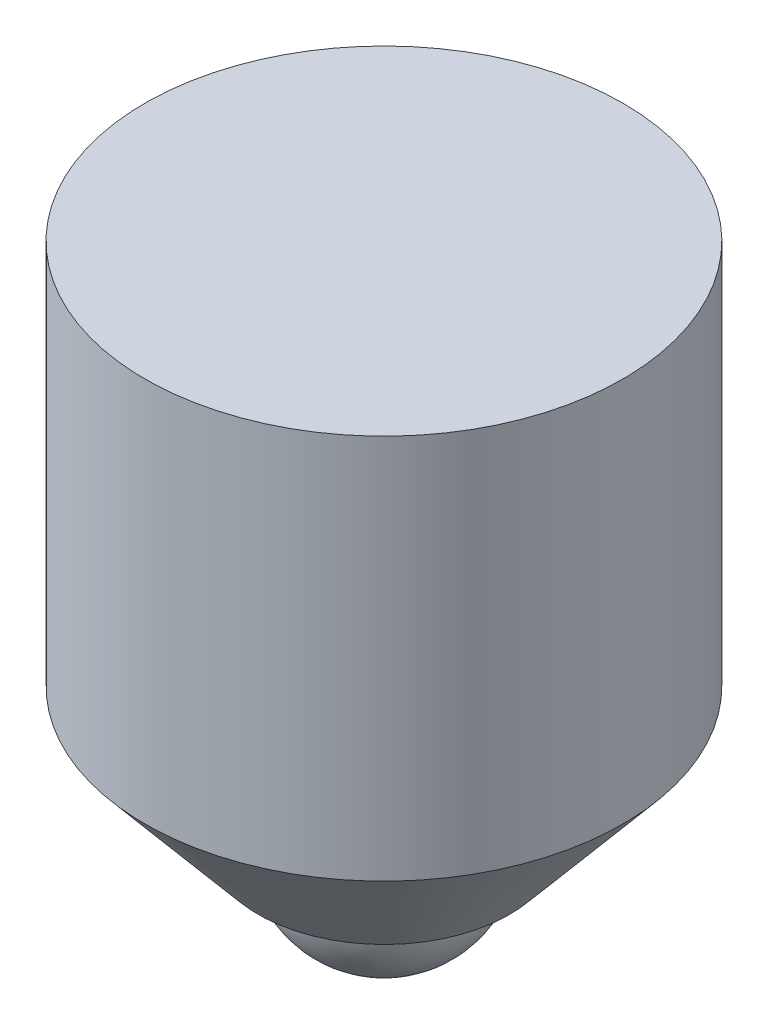
ISO-10303-21;
HEADER;
FILE_DESCRIPTION(('STEP AP214'),'2;1');
FILE_NAME('part.step','',(''),(''),'','','');
FILE_SCHEMA(('AUTOMOTIVE_DESIGN { 1 0 10303 214 1 1 1 1 }'));
ENDSEC;
DATA;
#1=APPLICATION_CONTEXT('core data for automotive mechanical design processes');
#2=APPLICATION_PROTOCOL_DEFINITION('international standard','automotive_design',2000,#1);
#3=PRODUCT_CONTEXT('',#1,'mechanical');
#4=PRODUCT('Part','Part','',(#3));
#5=PRODUCT_RELATED_PRODUCT_CATEGORY('part','',(#4));
#6=PRODUCT_DEFINITION_FORMATION('','',#4);
#7=PRODUCT_DEFINITION_CONTEXT('part definition',#1,'design');
#8=PRODUCT_DEFINITION('design','',#6,#7);
#9=PRODUCT_DEFINITION_SHAPE('','',#8);
#10=(LENGTH_UNIT() NAMED_UNIT(*) SI_UNIT(.MILLI.,.METRE.));
#11=(NAMED_UNIT(*) PLANE_ANGLE_UNIT() SI_UNIT($,.RADIAN.));
#12=(NAMED_UNIT(*) SI_UNIT($,.STERADIAN.) SOLID_ANGLE_UNIT());
#13=UNCERTAINTY_MEASURE_WITH_UNIT(LENGTH_MEASURE(1.E-05),#10,'distance_accuracy_value','');
#14=(GEOMETRIC_REPRESENTATION_CONTEXT(3) GLOBAL_UNCERTAINTY_ASSIGNED_CONTEXT((#13)) GLOBAL_UNIT_ASSIGNED_CONTEXT((#10,
#11,#12)) REPRESENTATION_CONTEXT('',''));
#15=CARTESIAN_POINT('',(0.,0.,0.));
#16=DIRECTION('',(0.,0.,1.));
#17=DIRECTION('',(1.,0.,0.));
#18=AXIS2_PLACEMENT_3D('',#15,#16,#17);
#19=CARTESIAN_POINT('',(0.,0.5,0.));
#20=DIRECTION('',(0.,-1.,0.));
#21=DIRECTION('',(0.,0.,1.));
#22=AXIS2_PLACEMENT_3D('',#19,#20,#21);
#23=SPHERICAL_SURFACE('',#22,0.5);
#24=CARTESIAN_POINT('',(0.,0.5,0.));
#25=DIRECTION('',(0.,-1.,0.));
#26=DIRECTION('',(0.,0.,-1.));
#27=AXIS2_PLACEMENT_3D('',#24,#25,#26);
#28=CIRCLE('',#27,0.5);
#29=CARTESIAN_POINT('',(0.,0.5,-0.5));
#30=VERTEX_POINT('',#29);
#31=EDGE_CURVE('E49',#30,#30,#28,.T.);
#32=ORIENTED_EDGE('',*,*,#31,.T.);
#33=EDGE_LOOP('',(#32));
#34=FACE_BOUND('',#33,.T.);
#35=ADVANCED_FACE('F35',(#34),#23,.T.);
#36=CARTESIAN_POINT('',(0.,3.2,1.24007338649024));
#37=DIRECTION('',(0.,-1.,0.));
#38=DIRECTION('',(0.,0.,-1.));
#39=AXIS2_PLACEMENT_3D('',#36,#37,#38);
#40=PLANE('',#39);
#41=CARTESIAN_POINT('',(0.,3.2,0.));
#42=DIRECTION('',(0.,-1.,0.));
#43=DIRECTION('',(0.,0.,-1.));
#44=AXIS2_PLACEMENT_3D('',#41,#42,#43);
#45=CIRCLE('',#44,1.24007338649024);
#46=CARTESIAN_POINT('',(0.,3.2,-1.24007338649024));
#47=VERTEX_POINT('',#46);
#48=EDGE_CURVE('E10',#47,#47,#45,.T.);
#49=ORIENTED_EDGE('',*,*,#48,.F.);
#50=EDGE_LOOP('',(#49));
#51=FACE_BOUND('',#50,.T.);
#52=ADVANCED_FACE('F69',(#51),#40,.F.);
#53=CARTESIAN_POINT('',(0.,0.,0.));
#54=DIRECTION('',(0.,-1.,0.));
#55=DIRECTION('',(0.,0.,-1.));
#56=AXIS2_PLACEMENT_3D('',#53,#54,#55);
#57=CYLINDRICAL_SURFACE('',#56,1.24007338649024);
#58=CARTESIAN_POINT('',(0.,1.2,0.));
#59=DIRECTION('',(0.,-1.,0.));
#60=DIRECTION('',(0.,0.,-1.));
#61=AXIS2_PLACEMENT_3D('',#58,#59,#60);
#62=CIRCLE('',#61,1.24007338649024);
#63=CARTESIAN_POINT('',(0.,1.2,-1.24007338649024));
#64=VERTEX_POINT('',#63);
#65=EDGE_CURVE('E41',#64,#64,#62,.T.);
#66=ORIENTED_EDGE('',*,*,#65,.F.);
#67=EDGE_LOOP('',(#66));
#68=FACE_BOUND('',#67,.T.);
#69=ORIENTED_EDGE('',*,*,#48,.T.);
#70=EDGE_LOOP('',(#69));
#71=FACE_BOUND('',#70,.T.);
#72=ADVANCED_FACE('F64',(#68,#71),#57,.T.);
#73=CARTESIAN_POINT('',(0.,1.2,0.));
#74=DIRECTION('',(0.,1.,0.));
#75=DIRECTION('',(0.,0.,1.));
#76=AXIS2_PLACEMENT_3D('',#73,#74,#75);
#77=CONICAL_SURFACE('',#76,1.24007338649024,0.698131700797733);
#78=CARTESIAN_POINT('',(0.,0.5,0.));
#79=DIRECTION('',(0.,-1.,0.));
#80=DIRECTION('',(0.,0.,-1.));
#81=AXIS2_PLACEMENT_3D('',#78,#79,#80);
#82=CIRCLE('',#81,0.65270364466614);
#83=CARTESIAN_POINT('',(0.,0.5,-0.65270364466614));
#84=VERTEX_POINT('',#83);
#85=EDGE_CURVE('E45',#84,#84,#82,.T.);
#86=ORIENTED_EDGE('',*,*,#85,.F.);
#87=EDGE_LOOP('',(#86));
#88=FACE_BOUND('',#87,.T.);
#89=ORIENTED_EDGE('',*,*,#65,.T.);
#90=EDGE_LOOP('',(#89));
#91=FACE_BOUND('',#90,.T.);
#92=ADVANCED_FACE('F59',(#88,#91),#77,.T.);
#93=CARTESIAN_POINT('',(0.,0.5,0.5));
#94=DIRECTION('',(0.,1.,0.));
#95=DIRECTION('',(0.,0.,1.));
#96=AXIS2_PLACEMENT_3D('',#93,#94,#95);
#97=PLANE('',#96);
#98=ORIENTED_EDGE('',*,*,#31,.F.);
#99=EDGE_LOOP('',(#98));
#100=FACE_BOUND('',#99,.T.);
#101=ORIENTED_EDGE('',*,*,#85,.T.);
#102=EDGE_LOOP('',(#101));
#103=FACE_BOUND('',#102,.T.);
#104=ADVANCED_FACE('F56',(#100,#103),#97,.F.);
#105=CLOSED_SHELL('',(#35,#52,#72,#92,#104));
#106=MANIFOLD_SOLID_BREP('B2',#105);
#107=ADVANCED_BREP_SHAPE_REPRESENTATION('',(#18,#106),#14);
#108=SHAPE_DEFINITION_REPRESENTATION(#9,#107);
ENDSEC;
END-ISO-10303-21;
